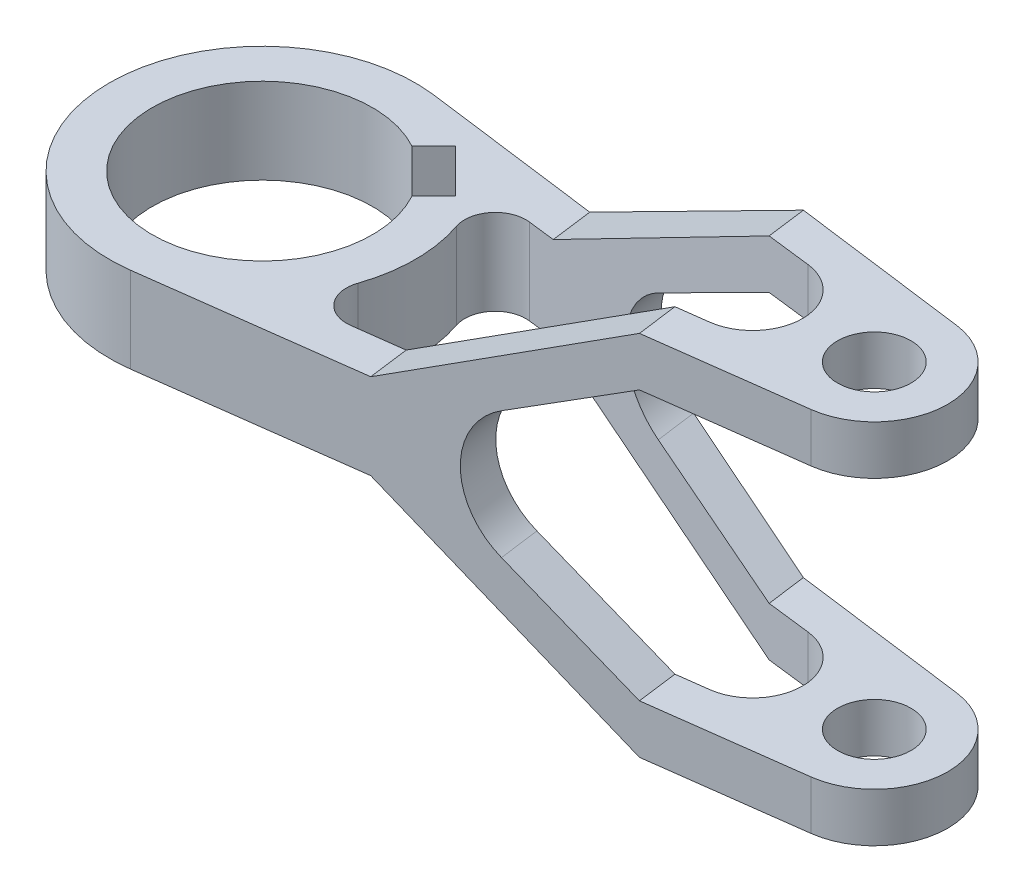
ISO-10303-21;
HEADER;
FILE_DESCRIPTION(('STEP AP214'),'2;1');
FILE_NAME('part.step','',(''),(''),'','','');
FILE_SCHEMA(('AUTOMOTIVE_DESIGN { 1 0 10303 214 1 1 1 1 }'));
ENDSEC;
DATA;
#1=APPLICATION_CONTEXT('core data for automotive mechanical design processes');
#2=APPLICATION_PROTOCOL_DEFINITION('international standard','automotive_design',2000,#1);
#3=PRODUCT_CONTEXT('',#1,'mechanical');
#4=PRODUCT('Part','Part','',(#3));
#5=PRODUCT_RELATED_PRODUCT_CATEGORY('part','',(#4));
#6=PRODUCT_DEFINITION_FORMATION('','',#4);
#7=PRODUCT_DEFINITION_CONTEXT('part definition',#1,'design');
#8=PRODUCT_DEFINITION('design','',#6,#7);
#9=PRODUCT_DEFINITION_SHAPE('','',#8);
#10=(LENGTH_UNIT() NAMED_UNIT(*) SI_UNIT(.MILLI.,.METRE.));
#11=(NAMED_UNIT(*) PLANE_ANGLE_UNIT() SI_UNIT($,.RADIAN.));
#12=(NAMED_UNIT(*) SI_UNIT($,.STERADIAN.) SOLID_ANGLE_UNIT());
#13=UNCERTAINTY_MEASURE_WITH_UNIT(LENGTH_MEASURE(1.E-05),#10,'distance_accuracy_value','');
#14=(GEOMETRIC_REPRESENTATION_CONTEXT(3) GLOBAL_UNCERTAINTY_ASSIGNED_CONTEXT((#13)) GLOBAL_UNIT_ASSIGNED_CONTEXT((#10,
#11,#12)) REPRESENTATION_CONTEXT('',''));
#15=CARTESIAN_POINT('',(0.,0.,0.));
#16=DIRECTION('',(0.,0.,1.));
#17=DIRECTION('',(1.,0.,0.));
#18=AXIS2_PLACEMENT_3D('',#15,#16,#17);
#19=CARTESIAN_POINT('',(100.,-30.,0.));
#20=DIRECTION('',(0.,1.,0.));
#21=DIRECTION('',(0.,0.,1.));
#22=AXIS2_PLACEMENT_3D('',#19,#20,#21);
#23=CYLINDRICAL_SURFACE('',#22,12.);
#24=DIRECTION('',(0.,1.,0.));
#25=VECTOR('',#24,1.);
#26=CARTESIAN_POINT('',(101.56,-30.,11.8981679261977));
#27=LINE('',#26,#25);
#28=CARTESIAN_POINT('',(101.56,22.,11.8981679261977));
#29=VERTEX_POINT('',#28);
#30=CARTESIAN_POINT('',(101.56,30.,11.8981679261977));
#31=VERTEX_POINT('',#30);
#32=EDGE_CURVE('E523',#29,#31,#27,.T.);
#33=ORIENTED_EDGE('',*,*,#32,.F.);
#34=CARTESIAN_POINT('',(100.,22.,0.));
#35=DIRECTION('',(0.,1.,0.));
#36=DIRECTION('',(-1.,0.,0.));
#37=AXIS2_PLACEMENT_3D('',#34,#35,#36);
#38=CIRCLE('',#37,12.);
#39=CARTESIAN_POINT('',(101.56,22.,-11.8981679261977));
#40=VERTEX_POINT('',#39);
#41=EDGE_CURVE('E379',#40,#29,#38,.F.);
#42=ORIENTED_EDGE('',*,*,#41,.F.);
#43=DIRECTION('',(0.,1.,0.));
#44=VECTOR('',#43,1.);
#45=CARTESIAN_POINT('',(101.56,-30.,-11.8981679261977));
#46=LINE('',#45,#44);
#47=CARTESIAN_POINT('',(101.56,30.,-11.8981679261977));
#48=VERTEX_POINT('',#47);
#49=EDGE_CURVE('E520',#40,#48,#46,.T.);
#50=ORIENTED_EDGE('',*,*,#49,.T.);
#51=CARTESIAN_POINT('',(100.,30.,0.));
#52=DIRECTION('',(0.,1.,0.));
#53=DIRECTION('',(0.,0.,1.));
#54=AXIS2_PLACEMENT_3D('',#51,#52,#53);
#55=CIRCLE('',#54,12.);
#56=EDGE_CURVE('E473',#31,#48,#55,.T.);
#57=ORIENTED_EDGE('',*,*,#56,.F.);
#58=EDGE_LOOP('',(#33,#42,#50,#57));
#59=FACE_BOUND('',#58,.T.);
#60=ADVANCED_FACE('F39',(#59),#23,.T.);
#61=CARTESIAN_POINT('',(79.8468488608504,-30.,-0.265397351138166));
#62=DIRECTION('',(0.,1.,0.));
#63=DIRECTION('',(0.,0.,1.));
#64=AXIS2_PLACEMENT_3D('',#61,#62,#63);
#65=CYLINDRICAL_SURFACE('',#64,8.15489857556715);
#66=DIRECTION('',(0.,1.,0.));
#67=VECTOR('',#66,1.);
#68=CARTESIAN_POINT('',(80.8254366899184,-30.,-8.36136774625368));
#69=LINE('',#68,#67);
#70=CARTESIAN_POINT('',(80.8254366899184,22.,-8.36136774625369));
#71=VERTEX_POINT('',#70);
#72=CARTESIAN_POINT('',(80.8254366899184,30.,-8.36136774625368));
#73=VERTEX_POINT('',#72);
#74=EDGE_CURVE('E499',#71,#73,#69,.T.);
#75=ORIENTED_EDGE('',*,*,#74,.F.);
#76=CARTESIAN_POINT('',(79.8468488608504,22.,-0.265397351138166));
#77=DIRECTION('',(0.,1.,0.));
#78=DIRECTION('',(-1.,0.,0.));
#79=AXIS2_PLACEMENT_3D('',#76,#77,#78);
#80=CIRCLE('',#79,8.15489857556715);
#81=CARTESIAN_POINT('',(80.9069856756741,22.,7.82029870496254));
#82=VERTEX_POINT('',#81);
#83=EDGE_CURVE('E310',#71,#82,#80,.F.);
#84=ORIENTED_EDGE('',*,*,#83,.T.);
#85=DIRECTION('',(0.,1.,0.));
#86=VECTOR('',#85,1.);
#87=CARTESIAN_POINT('',(80.9069856756741,-30.,7.82029870496254));
#88=LINE('',#87,#86);
#89=CARTESIAN_POINT('',(80.9069856756741,30.,7.82029870496254));
#90=VERTEX_POINT('',#89);
#91=EDGE_CURVE('E503',#82,#90,#88,.T.);
#92=ORIENTED_EDGE('',*,*,#91,.T.);
#93=CARTESIAN_POINT('',(79.8468488608504,30.,-0.265397351138166));
#94=DIRECTION('',(0.,1.,0.));
#95=DIRECTION('',(0.,0.,1.));
#96=AXIS2_PLACEMENT_3D('',#93,#94,#95);
#97=CIRCLE('',#96,8.15489857556715);
#98=EDGE_CURVE('E464',#90,#73,#97,.T.);
#99=ORIENTED_EDGE('',*,*,#98,.T.);
#100=EDGE_LOOP('',(#75,#84,#92,#99));
#101=FACE_BOUND('',#100,.T.);
#102=ADVANCED_FACE('F558',(#101),#65,.F.);
#103=CARTESIAN_POINT('',(100.,-30.,0.));
#104=DIRECTION('',(0.,1.,0.));
#105=DIRECTION('',(0.,0.,1.));
#106=AXIS2_PLACEMENT_3D('',#103,#104,#105);
#107=CYLINDRICAL_SURFACE('',#106,6.);
#108=CARTESIAN_POINT('',(100.,22.,0.));
#109=DIRECTION('',(0.,1.,0.));
#110=DIRECTION('',(-1.,0.,0.));
#111=AXIS2_PLACEMENT_3D('',#108,#109,#110);
#112=CIRCLE('',#111,6.);
#113=CARTESIAN_POINT('',(94.,22.,0.));
#114=VERTEX_POINT('',#113);
#115=EDGE_CURVE('E307',#114,#114,#112,.F.);
#116=ORIENTED_EDGE('',*,*,#115,.T.);
#117=EDGE_LOOP('',(#116));
#118=FACE_BOUND('',#117,.T.);
#119=CARTESIAN_POINT('',(100.,30.,0.));
#120=DIRECTION('',(0.,1.,0.));
#121=DIRECTION('',(0.,0.,1.));
#122=AXIS2_PLACEMENT_3D('',#119,#120,#121);
#123=CIRCLE('',#122,6.);
#124=CARTESIAN_POINT('',(100.,30.,6.));
#125=VERTEX_POINT('',#124);
#126=EDGE_CURVE('E458',#125,#125,#123,.T.);
#127=ORIENTED_EDGE('',*,*,#126,.T.);
#128=EDGE_LOOP('',(#127));
#129=FACE_BOUND('',#128,.T.);
#130=ADVANCED_FACE('F618',(#118,#129),#107,.F.);
#131=CARTESIAN_POINT('',(0.,-30.,0.));
#132=DIRECTION('',(0.,1.,0.));
#133=DIRECTION('',(0.,0.,1.));
#134=AXIS2_PLACEMENT_3D('',#131,#132,#133);
#135=CYLINDRICAL_SURFACE('',#134,25.);
#136=CARTESIAN_POINT('',(0.,-7.,0.));
#137=DIRECTION('',(0.,-1.,0.));
#138=DIRECTION('',(1.,0.,0.));
#139=AXIS2_PLACEMENT_3D('',#136,#137,#138);
#140=CIRCLE('',#139,25.);
#141=CARTESIAN_POINT('',(3.25000000000001,-7.,-24.7878498462452));
#142=VERTEX_POINT('',#141);
#143=CARTESIAN_POINT('',(3.25,-7.,24.7878498462453));
#144=VERTEX_POINT('',#143);
#145=EDGE_CURVE('E421',#142,#144,#140,.F.);
#146=ORIENTED_EDGE('',*,*,#145,.T.);
#147=DIRECTION('',(0.,1.,0.));
#148=VECTOR('',#147,1.);
#149=CARTESIAN_POINT('',(3.25000000000001,-30.,24.7878498462452));
#150=LINE('',#149,#148);
#151=CARTESIAN_POINT('',(3.25,7.,24.7878498462453));
#152=VERTEX_POINT('',#151);
#153=EDGE_CURVE('E514',#144,#152,#150,.T.);
#154=ORIENTED_EDGE('',*,*,#153,.T.);
#155=CARTESIAN_POINT('',(0.,7.,0.));
#156=DIRECTION('',(0.,-1.,0.));
#157=DIRECTION('',(1.,0.,0.));
#158=AXIS2_PLACEMENT_3D('',#155,#156,#157);
#159=CIRCLE('',#158,25.);
#160=CARTESIAN_POINT('',(3.25000000000001,6.99999999999999,-24.7878498462452));
#161=VERTEX_POINT('',#160);
#162=EDGE_CURVE('E455',#161,#152,#159,.F.);
#163=ORIENTED_EDGE('',*,*,#162,.F.);
#164=DIRECTION('',(0.,1.,0.));
#165=VECTOR('',#164,1.);
#166=CARTESIAN_POINT('',(3.25000000000001,-30.,-24.7878498462452));
#167=LINE('',#166,#165);
#168=EDGE_CURVE('E515',#142,#161,#167,.T.);
#169=ORIENTED_EDGE('',*,*,#168,.F.);
#170=EDGE_LOOP('',(#146,#154,#163,#169));
#171=FACE_BOUND('',#170,.T.);
#172=ADVANCED_FACE('F41',(#171),#135,.T.);
#173=CARTESIAN_POINT('',(3.25000000000001,-30.,-24.7878498462452));
#174=DIRECTION('',(0.13,0.,-0.991513993849809));
#175=DIRECTION('',(-0.99151399384981,0.,-0.13));
#176=AXIS2_PLACEMENT_3D('',#173,#174,#175);
#177=PLANE('',#176);
#178=DIRECTION('',(0.99151399384981,0.,0.13));
#179=VECTOR('',#178,1.);
#180=CARTESIAN_POINT('',(3.25,22.,-24.7878498462452));
#181=LINE('',#180,#179);
#182=CARTESIAN_POINT('',(72.7304389916733,22.,-15.6780872761309));
#183=VERTEX_POINT('',#182);
#184=EDGE_CURVE('E381',#183,#40,#181,.T.);
#185=ORIENTED_EDGE('',*,*,#184,.F.);
#186=DIRECTION('',(0.865899632431298,0.487163916222032,0.113530371648108));
#187=VECTOR('',#186,1.);
#188=CARTESIAN_POINT('',(-2.19572195163312,-20.1542181397328,-25.5018527328445));
#189=LINE('',#188,#187);
#190=CARTESIAN_POINT('',(52.0985764233662,10.3923048454133,-18.3831848849562));
#191=VERTEX_POINT('',#190);
#192=EDGE_CURVE('E386',#191,#183,#189,.T.);
#193=ORIENTED_EDGE('',*,*,#192,.F.);
#194=CARTESIAN_POINT('',(58.2557736528206,0.,-17.5758986088229));
#195=DIRECTION('',(0.13,0.,-0.991513993849809));
#196=DIRECTION('',(0.99151399384981,0.,0.13));
#197=AXIS2_PLACEMENT_3D('',#194,#195,#196);
#198=ELLIPSE('',#197,12.4197888635893,12.);
#199=CARTESIAN_POINT('',(52.0985764233662,-10.3923048454133,-18.3831848849562));
#200=VERTEX_POINT('',#199);
#201=EDGE_CURVE('E391',#200,#191,#198,.T.);
#202=ORIENTED_EDGE('',*,*,#201,.F.);
#203=DIRECTION('',(-0.865899632431298,0.487163916222032,-0.113530371648108));
#204=VECTOR('',#203,1.);
#205=CARTESIAN_POINT('',(23.1143814077938,5.91449726360561,-22.1833787051104));
#206=LINE('',#205,#204);
#207=CARTESIAN_POINT('',(72.7304389916733,-22.,-15.6780872761309));
#208=VERTEX_POINT('',#207);
#209=EDGE_CURVE('E396',#208,#200,#206,.T.);
#210=ORIENTED_EDGE('',*,*,#209,.F.);
#211=DIRECTION('',(-0.99151399384981,0.,-0.13));
#212=VECTOR('',#211,1.);
#213=CARTESIAN_POINT('',(3.25000000000001,-22.,-24.7878498462452));
#214=LINE('',#213,#212);
#215=CARTESIAN_POINT('',(101.56,-22.,-11.8981679261977));
#216=VERTEX_POINT('',#215);
#217=EDGE_CURVE('E311',#216,#208,#214,.T.);
#218=ORIENTED_EDGE('',*,*,#217,.F.);
#219=CARTESIAN_POINT('',(101.56,-30.,-11.8981679261977));
#220=VERTEX_POINT('',#219);
#221=EDGE_CURVE('E517',#220,#216,#46,.T.);
#222=ORIENTED_EDGE('',*,*,#221,.F.);
#223=DIRECTION('',(-0.991513993849809,0.,-0.13));
#224=VECTOR('',#223,1.);
#225=CARTESIAN_POINT('',(3.25000000000001,-30.,-24.7878498462452));
#226=LINE('',#225,#224);
#227=CARTESIAN_POINT('',(72.7304389916733,-30.,-15.6780872761309));
#228=VERTEX_POINT('',#227);
#229=EDGE_CURVE('E511',#220,#228,#226,.T.);
#230=ORIENTED_EDGE('',*,*,#229,.T.);
#231=DIRECTION('',(-0.862291237243005,0.493631316767308,-0.113057265491879));
#232=VECTOR('',#231,1.);
#233=CARTESIAN_POINT('',(20.1804289764802,0.0830270789643206,-22.568056902732));
#234=LINE('',#233,#232);
#235=CARTESIAN_POINT('',(32.553291021262,-7.,-20.9458185119491));
#236=VERTEX_POINT('',#235);
#237=EDGE_CURVE('E425',#228,#236,#234,.T.);
#238=ORIENTED_EDGE('',*,*,#237,.T.);
#239=DIRECTION('',(-0.991513993849809,0.,-0.13));
#240=VECTOR('',#239,1.);
#241=CARTESIAN_POINT('',(3.25000000000001,-7.,-24.7878498462452));
#242=LINE('',#241,#240);
#243=EDGE_CURVE('E418',#236,#142,#242,.T.);
#244=ORIENTED_EDGE('',*,*,#243,.T.);
#245=ORIENTED_EDGE('',*,*,#168,.T.);
#246=DIRECTION('',(-0.991513993849809,0.,-0.13));
#247=VECTOR('',#246,1.);
#248=CARTESIAN_POINT('',(3.25000000000001,6.99999999999999,-24.7878498462452));
#249=LINE('',#248,#247);
#250=CARTESIAN_POINT('',(32.553291021262,7.,-20.9458185119491));
#251=VERTEX_POINT('',#250);
#252=EDGE_CURVE('E452',#251,#161,#249,.T.);
#253=ORIENTED_EDGE('',*,*,#252,.F.);
#254=DIRECTION('',(-0.862291237243005,-0.493631316767308,-0.113057265491879));
#255=VECTOR('',#254,1.);
#256=CARTESIAN_POINT('',(-5.35880855615031,-14.7033396925699,-25.916573312824));
#257=LINE('',#256,#255);
#258=CARTESIAN_POINT('',(72.7304389916733,30.,-15.6780872761309));
#259=VERTEX_POINT('',#258);
#260=EDGE_CURVE('E283',#259,#251,#257,.T.);
#261=ORIENTED_EDGE('',*,*,#260,.F.);
#262=DIRECTION('',(-0.991513993849809,0.,-0.13));
#263=VECTOR('',#262,1.);
#264=CARTESIAN_POINT('',(3.25000000000001,30.,-24.7878498462452));
#265=LINE('',#264,#263);
#266=EDGE_CURVE('E476',#48,#259,#265,.T.);
#267=ORIENTED_EDGE('',*,*,#266,.F.);
#268=ORIENTED_EDGE('',*,*,#49,.F.);
#269=EDGE_LOOP('',(#185,#193,#202,#210,#218,#222,#230,#238,#244,#245,#253,#261,#267,#268));
#270=FACE_BOUND('',#269,.T.);
#271=ADVANCED_FACE('F546',(#270),#177,.T.);
#272=CARTESIAN_POINT('',(3.25000000000001,-30.,24.7878498462452));
#273=DIRECTION('',(0.13,0.,0.991513993849809));
#274=DIRECTION('',(0.99151399384981,0.,-0.13));
#275=AXIS2_PLACEMENT_3D('',#272,#273,#274);
#276=PLANE('',#275);
#277=DIRECTION('',(-0.99151399384981,0.,0.13));
#278=VECTOR('',#277,1.);
#279=CARTESIAN_POINT('',(113.458167926198,22.,10.3381679261977));
#280=LINE('',#279,#278);
#281=CARTESIAN_POINT('',(76.7721501537547,22.,15.1481679261977));
#282=VERTEX_POINT('',#281);
#283=EDGE_CURVE('E331',#29,#282,#280,.T.);
#284=ORIENTED_EDGE('',*,*,#283,.F.);
#285=ORIENTED_EDGE('',*,*,#32,.T.);
#286=DIRECTION('',(0.991513993849809,0.,-0.13));
#287=VECTOR('',#286,1.);
#288=CARTESIAN_POINT('',(3.25000000000001,30.,24.7878498462452));
#289=LINE('',#288,#287);
#290=CARTESIAN_POINT('',(76.7721501537547,30.,15.1481679261977));
#291=VERTEX_POINT('',#290);
#292=EDGE_CURVE('E470',#291,#31,#289,.T.);
#293=ORIENTED_EDGE('',*,*,#292,.F.);
#294=DIRECTION('',(0.854908218410472,0.506525355946065,-0.112089258530623));
#295=VECTOR('',#294,1.);
#296=CARTESIAN_POINT('',(37.9529897847433,7.,20.2378498462452));
#297=LINE('',#296,#295);
#298=CARTESIAN_POINT('',(37.9529897847433,7.,20.2378498462452));
#299=VERTEX_POINT('',#298);
#300=EDGE_CURVE('E431',#299,#291,#297,.T.);
#301=ORIENTED_EDGE('',*,*,#300,.F.);
#302=DIRECTION('',(0.991513993849809,0.,-0.13));
#303=VECTOR('',#302,1.);
#304=CARTESIAN_POINT('',(-21.5378498462452,7.,28.0378498462453));
#305=LINE('',#304,#303);
#306=EDGE_CURVE('E428',#152,#299,#305,.T.);
#307=ORIENTED_EDGE('',*,*,#306,.F.);
#308=ORIENTED_EDGE('',*,*,#153,.F.);
#309=DIRECTION('',(0.991513993849809,0.,-0.13));
#310=VECTOR('',#309,1.);
#311=CARTESIAN_POINT('',(-21.5378498462452,-7.,28.0378498462453));
#312=LINE('',#311,#310);
#313=CARTESIAN_POINT('',(37.9529897847433,-7.,20.2378498462452));
#314=VERTEX_POINT('',#313);
#315=EDGE_CURVE('E401',#144,#314,#312,.T.);
#316=ORIENTED_EDGE('',*,*,#315,.T.);
#317=DIRECTION('',(0.854908218410472,-0.506525355946065,-0.112089258530623));
#318=VECTOR('',#317,1.);
#319=CARTESIAN_POINT('',(37.9529897847433,-7.,20.2378498462452));
#320=LINE('',#319,#318);
#321=CARTESIAN_POINT('',(76.7721501537547,-30.,15.1481679261977));
#322=VERTEX_POINT('',#321);
#323=EDGE_CURVE('E398',#314,#322,#320,.T.);
#324=ORIENTED_EDGE('',*,*,#323,.T.);
#325=DIRECTION('',(0.991513993849809,0.,-0.13));
#326=VECTOR('',#325,1.);
#327=CARTESIAN_POINT('',(3.25000000000001,-30.,24.7878498462452));
#328=LINE('',#327,#326);
#329=CARTESIAN_POINT('',(101.56,-30.,11.8981679261977));
#330=VERTEX_POINT('',#329);
#331=EDGE_CURVE('E493',#322,#330,#328,.T.);
#332=ORIENTED_EDGE('',*,*,#331,.T.);
#333=CARTESIAN_POINT('',(101.56,-22.,11.8981679261977));
#334=VERTEX_POINT('',#333);
#335=EDGE_CURVE('E521',#330,#334,#27,.T.);
#336=ORIENTED_EDGE('',*,*,#335,.T.);
#337=DIRECTION('',(0.99151399384981,0.,-0.13));
#338=VECTOR('',#337,1.);
#339=CARTESIAN_POINT('',(76.7721501537547,-22.,15.1481679261977));
#340=LINE('',#339,#338);
#341=CARTESIAN_POINT('',(76.7721501537547,-22.,15.1481679261977));
#342=VERTEX_POINT('',#341);
#343=EDGE_CURVE('E349',#342,#334,#340,.T.);
#344=ORIENTED_EDGE('',*,*,#343,.F.);
#345=DIRECTION('',(0.858676306881702,-0.500000000000001,-0.112583302491977));
#346=VECTOR('',#345,1.);
#347=CARTESIAN_POINT('',(56.8376445402564,-10.3923048454133,17.7618332358447));
#348=LINE('',#347,#346);
#349=CARTESIAN_POINT('',(56.8376445402564,-10.3923048454133,17.7618332358447));
#350=VERTEX_POINT('',#349);
#351=EDGE_CURVE('E346',#350,#342,#348,.T.);
#352=ORIENTED_EDGE('',*,*,#351,.F.);
#353=CARTESIAN_POINT('',(62.7867285033553,0.,16.9818332358447));
#354=DIRECTION('',(0.13,0.,0.99151399384981));
#355=DIRECTION('',(0.99151399384981,0.,-0.13));
#356=AXIS2_PLACEMENT_3D('',#353,#354,#355);
#357=CIRCLE('',#356,12.);
#358=CARTESIAN_POINT('',(56.8376445402564,10.3923048454133,17.7618332358447));
#359=VERTEX_POINT('',#358);
#360=EDGE_CURVE('E343',#359,#350,#357,.T.);
#361=ORIENTED_EDGE('',*,*,#360,.F.);
#362=DIRECTION('',(-0.858676306881702,-0.500000000000001,0.112583302491977));
#363=VECTOR('',#362,1.);
#364=CARTESIAN_POINT('',(56.8376445402564,10.3923048454133,17.7618332358447));
#365=LINE('',#364,#363);
#366=EDGE_CURVE('E334',#282,#359,#365,.T.);
#367=ORIENTED_EDGE('',*,*,#366,.F.);
#368=EDGE_LOOP('',(#284,#285,#293,#301,#307,#308,#316,#324,#332,#336,#344,#352,#361,#367));
#369=FACE_BOUND('',#368,.T.);
#370=ADVANCED_FACE('F531',(#369),#276,.T.);
#371=CARTESIAN_POINT('',(0.,-30.,0.));
#372=DIRECTION('',(0.,1.,0.));
#373=DIRECTION('',(0.,0.,1.));
#374=AXIS2_PLACEMENT_3D('',#371,#372,#373);
#375=PLANE('',#374);
#376=CARTESIAN_POINT('',(100.,-30.,0.));
#377=DIRECTION('',(0.,1.,0.));
#378=DIRECTION('',(0.,0.,1.));
#379=AXIS2_PLACEMENT_3D('',#376,#377,#378);
#380=CIRCLE('',#379,6.);
#381=CARTESIAN_POINT('',(100.,-30.,6.));
#382=VERTEX_POINT('',#381);
#383=EDGE_CURVE('E479',#382,#382,#380,.T.);
#384=ORIENTED_EDGE('',*,*,#383,.T.);
#385=EDGE_LOOP('',(#384));
#386=FACE_BOUND('',#385,.T.);
#387=DIRECTION('',(0.13,0.,0.991513993849809));
#388=VECTOR('',#387,1.);
#389=CARTESIAN_POINT('',(69.8772296737428,-30.,-37.4396024000594));
#390=LINE('',#389,#388);
#391=CARTESIAN_POINT('',(73.5748456620722,-30.,-9.23777165920292));
#392=VERTEX_POINT('',#391);
#393=EDGE_CURVE('E407',#228,#392,#390,.T.);
#394=ORIENTED_EDGE('',*,*,#393,.F.);
#395=ORIENTED_EDGE('',*,*,#229,.F.);
#396=CARTESIAN_POINT('',(100.,-30.,0.));
#397=DIRECTION('',(0.,1.,0.));
#398=DIRECTION('',(0.,0.,1.));
#399=AXIS2_PLACEMENT_3D('',#396,#397,#398);
#400=CIRCLE('',#399,12.);
#401=EDGE_CURVE('E508',#330,#220,#400,.T.);
#402=ORIENTED_EDGE('',*,*,#401,.F.);
#403=ORIENTED_EDGE('',*,*,#331,.F.);
#404=CARTESIAN_POINT('',(75.8974898399409,-30.,8.47710684149396));
#405=VERTEX_POINT('',#404);
#406=EDGE_CURVE('E404',#405,#322,#390,.T.);
#407=ORIENTED_EDGE('',*,*,#406,.F.);
#408=DIRECTION('',(0.991513993849809,0.,-0.13));
#409=VECTOR('',#408,1.);
#410=CARTESIAN_POINT('',(29.0516392942011,-30.,14.6191891607765));
#411=LINE('',#410,#409);
#412=CARTESIAN_POINT('',(80.9069856756741,-30.,7.82029870496254));
#413=VERTEX_POINT('',#412);
#414=EDGE_CURVE('E482',#405,#413,#411,.T.);
#415=ORIENTED_EDGE('',*,*,#414,.T.);
#416=CARTESIAN_POINT('',(79.8468488608504,-30.,-0.265397351138166));
#417=DIRECTION('',(0.,1.,0.));
#418=DIRECTION('',(0.,0.,1.));
#419=AXIS2_PLACEMENT_3D('',#416,#417,#418);
#420=CIRCLE('',#419,8.15489857556715);
#421=CARTESIAN_POINT('',(80.8254366899184,-30.,-8.36136774625368));
#422=VERTEX_POINT('',#421);
#423=EDGE_CURVE('E484',#413,#422,#420,.T.);
#424=ORIENTED_EDGE('',*,*,#423,.T.);
#425=DIRECTION('',(-0.992773891679269,0.,-0.12));
#426=VECTOR('',#425,1.);
#427=CARTESIAN_POINT('',(29.0016392942011,-30.,-14.6254886499238));
#428=LINE('',#427,#426);
#429=EDGE_CURVE('E487',#422,#392,#428,.T.);
#430=ORIENTED_EDGE('',*,*,#429,.T.);
#431=EDGE_LOOP('',(#394,#395,#402,#403,#407,#415,#424,#430));
#432=FACE_BOUND('',#431,.T.);
#433=ADVANCED_FACE('F581',(#386,#432),#375,.F.);
#434=CARTESIAN_POINT('',(0.,-30.,0.));
#435=DIRECTION('',(0.,1.,0.));
#436=DIRECTION('',(0.,0.,1.));
#437=AXIS2_PLACEMENT_3D('',#434,#435,#436);
#438=CYLINDRICAL_SURFACE('',#437,25.);
#439=CARTESIAN_POINT('',(0.,-7.,0.));
#440=DIRECTION('',(0.,-1.,0.));
#441=DIRECTION('',(1.,0.,0.));
#442=AXIS2_PLACEMENT_3D('',#439,#440,#441);
#443=CIRCLE('',#442,25.);
#444=CARTESIAN_POINT('',(23.6680327451676,-7.,-8.05134932627292));
#445=VERTEX_POINT('',#444);
#446=CARTESIAN_POINT('',(23.6680327451676,-7.,8.05134932627293));
#447=VERTEX_POINT('',#446);
#448=EDGE_CURVE('E412',#445,#447,#443,.T.);
#449=ORIENTED_EDGE('',*,*,#448,.F.);
#450=DIRECTION('',(0.,1.,0.));
#451=VECTOR('',#450,1.);
#452=CARTESIAN_POINT('',(23.6680327451676,-30.,-8.05134932627292));
#453=LINE('',#452,#451);
#454=CARTESIAN_POINT('',(23.6680327451676,7.,-8.05134932627292));
#455=VERTEX_POINT('',#454);
#456=EDGE_CURVE('E491',#445,#455,#453,.T.);
#457=ORIENTED_EDGE('',*,*,#456,.T.);
#458=CARTESIAN_POINT('',(0.,7.,0.));
#459=DIRECTION('',(0.,-1.,0.));
#460=DIRECTION('',(1.,0.,0.));
#461=AXIS2_PLACEMENT_3D('',#458,#459,#460);
#462=CIRCLE('',#461,25.);
#463=CARTESIAN_POINT('',(23.6680327451676,7.,8.05134932627293));
#464=VERTEX_POINT('',#463);
#465=EDGE_CURVE('E443',#455,#464,#462,.T.);
#466=ORIENTED_EDGE('',*,*,#465,.T.);
#467=DIRECTION('',(0.,1.,0.));
#468=VECTOR('',#467,1.);
#469=CARTESIAN_POINT('',(23.6680327451676,-30.,8.05134932627293));
#470=LINE('',#469,#468);
#471=EDGE_CURVE('E490',#447,#464,#470,.T.);
#472=ORIENTED_EDGE('',*,*,#471,.F.);
#473=EDGE_LOOP('',(#449,#457,#466,#472));
#474=FACE_BOUND('',#473,.T.);
#475=ADVANCED_FACE('F846',(#474),#438,.T.);
#476=CARTESIAN_POINT('',(28.4016392942011,-30.,-9.6616191915275));
#477=DIRECTION('',(0.,1.,0.));
#478=DIRECTION('',(0.,0.,1.));
#479=AXIS2_PLACEMENT_3D('',#476,#477,#478);
#480=CYLINDRICAL_SURFACE('',#479,5.);
#481=CARTESIAN_POINT('',(28.4016392942011,-7.,-9.6616191915275));
#482=DIRECTION('',(0.,-1.,0.));
#483=DIRECTION('',(1.,0.,0.));
#484=AXIS2_PLACEMENT_3D('',#481,#482,#483);
#485=CIRCLE('',#484,5.);
#486=CARTESIAN_POINT('',(29.0016392942011,-7.,-14.6254886499238));
#487=VERTEX_POINT('',#486);
#488=EDGE_CURVE('E414',#487,#445,#485,.F.);
#489=ORIENTED_EDGE('',*,*,#488,.F.);
#490=DIRECTION('',(0.,1.,0.));
#491=VECTOR('',#490,1.);
#492=CARTESIAN_POINT('',(29.0016392942011,-30.,-14.6254886499238));
#493=LINE('',#492,#491);
#494=CARTESIAN_POINT('',(29.0016392942011,7.,-14.6254886499238));
#495=VERTEX_POINT('',#494);
#496=EDGE_CURVE('E494',#487,#495,#493,.T.);
#497=ORIENTED_EDGE('',*,*,#496,.T.);
#498=CARTESIAN_POINT('',(28.4016392942011,7.,-9.6616191915275));
#499=DIRECTION('',(0.,-1.,0.));
#500=DIRECTION('',(1.,0.,0.));
#501=AXIS2_PLACEMENT_3D('',#498,#499,#500);
#502=CIRCLE('',#501,5.);
#503=EDGE_CURVE('E446',#495,#455,#502,.F.);
#504=ORIENTED_EDGE('',*,*,#503,.T.);
#505=ORIENTED_EDGE('',*,*,#456,.F.);
#506=EDGE_LOOP('',(#489,#497,#504,#505));
#507=FACE_BOUND('',#506,.T.);
#508=ADVANCED_FACE('F838',(#507),#480,.F.);
#509=CARTESIAN_POINT('',(29.0016392942011,-30.,-14.6254886499238));
#510=DIRECTION('',(0.12,0.,-0.992773891679269));
#511=DIRECTION('',(-0.992773891679269,0.,-0.12));
#512=AXIS2_PLACEMENT_3D('',#509,#510,#511);
#513=PLANE('',#512);
#514=DIRECTION('',(0.866456824803477,0.488143276417034,0.104731621014474));
#515=VECTOR('',#514,1.);
#516=CARTESIAN_POINT('',(17.6290510714964,-9.51866624097763,-16.0001325624628));
#517=LINE('',#516,#515);
#518=CARTESIAN_POINT('',(52.971127096588,10.3923048454133,-11.7282140938604));
#519=VERTEX_POINT('',#518);
#520=CARTESIAN_POINT('',(73.5748456620722,22.,-9.23777165920292));
#521=VERTEX_POINT('',#520);
#522=EDGE_CURVE('E383',#519,#521,#517,.T.);
#523=ORIENTED_EDGE('',*,*,#522,.T.);
#524=DIRECTION('',(0.992773891679269,0.,0.12));
#525=VECTOR('',#524,1.);
#526=CARTESIAN_POINT('',(29.0016392942011,22.,-14.6254886499239));
#527=LINE('',#526,#525);
#528=EDGE_CURVE('E376',#521,#71,#527,.T.);
#529=ORIENTED_EDGE('',*,*,#528,.T.);
#530=ORIENTED_EDGE('',*,*,#74,.T.);
#531=DIRECTION('',(-0.992773891679269,0.,-0.12));
#532=VECTOR('',#531,1.);
#533=CARTESIAN_POINT('',(29.0016392942011,30.,-14.6254886499238));
#534=LINE('',#533,#532);
#535=CARTESIAN_POINT('',(73.5748456620722,30.,-9.23777165920292));
#536=VERTEX_POINT('',#535);
#537=EDGE_CURVE('E467',#73,#536,#534,.T.);
#538=ORIENTED_EDGE('',*,*,#537,.T.);
#539=DIRECTION('',(-0.862831666687416,-0.494615400324786,-0.104293435665752));
#540=VECTOR('',#539,1.);
#541=CARTESIAN_POINT('',(14.3000345514443,-3.97908950098908,-16.4025222563845));
#542=LINE('',#541,#540);
#543=CARTESIAN_POINT('',(33.4525034932287,7.,-14.0874973627236));
#544=VERTEX_POINT('',#543);
#545=EDGE_CURVE('E288',#536,#544,#542,.T.);
#546=ORIENTED_EDGE('',*,*,#545,.T.);
#547=DIRECTION('',(-0.992773891679269,0.,-0.12));
#548=VECTOR('',#547,1.);
#549=CARTESIAN_POINT('',(29.0016392942011,7.,-14.6254886499238));
#550=LINE('',#549,#548);
#551=EDGE_CURVE('E449',#544,#495,#550,.T.);
#552=ORIENTED_EDGE('',*,*,#551,.T.);
#553=ORIENTED_EDGE('',*,*,#496,.F.);
#554=DIRECTION('',(-0.992773891679269,0.,-0.12));
#555=VECTOR('',#554,1.);
#556=CARTESIAN_POINT('',(29.0016392942011,-7.,-14.6254886499238));
#557=LINE('',#556,#555);
#558=CARTESIAN_POINT('',(33.4525034932287,-7.,-14.0874973627236));
#559=VERTEX_POINT('',#558);
#560=EDGE_CURVE('E416',#559,#487,#557,.T.);
#561=ORIENTED_EDGE('',*,*,#560,.F.);
#562=DIRECTION('',(-0.862831666687416,0.494615400324786,-0.104293435665752));
#563=VECTOR('',#562,1.);
#564=CARTESIAN_POINT('',(39.9062243653343,-10.6995741533178,-13.3074138904007));
#565=LINE('',#564,#563);
#566=EDGE_CURVE('E423',#392,#559,#565,.T.);
#567=ORIENTED_EDGE('',*,*,#566,.F.);
#568=ORIENTED_EDGE('',*,*,#429,.F.);
#569=CARTESIAN_POINT('',(80.8254366899184,-22.,-8.36136774625368));
#570=VERTEX_POINT('',#569);
#571=EDGE_CURVE('E496',#422,#570,#69,.T.);
#572=ORIENTED_EDGE('',*,*,#571,.T.);
#573=DIRECTION('',(-0.992773891679269,0.,-0.12));
#574=VECTOR('',#573,1.);
#575=CARTESIAN_POINT('',(29.0016392942011,-22.,-14.6254886499238));
#576=LINE('',#575,#574);
#577=CARTESIAN_POINT('',(73.5748456620722,-22.,-9.23777165920292));
#578=VERTEX_POINT('',#577);
#579=EDGE_CURVE('E62',#570,#578,#576,.T.);
#580=ORIENTED_EDGE('',*,*,#579,.T.);
#581=DIRECTION('',(-0.866456824803477,0.488143276417034,-0.104731621014474));
#582=VECTOR('',#581,1.);
#583=CARTESIAN_POINT('',(43.0063554715046,-4.77836525769178,-12.9326903648745));
#584=LINE('',#583,#582);
#585=CARTESIAN_POINT('',(52.971127096588,-10.3923048454133,-11.7282140938604));
#586=VERTEX_POINT('',#585);
#587=EDGE_CURVE('E393',#578,#586,#584,.T.);
#588=ORIENTED_EDGE('',*,*,#587,.T.);
#589=CARTESIAN_POINT('',(59.1199252696977,0.,-10.984987678503));
#590=DIRECTION('',(0.12,0.,-0.992773891679269));
#591=DIRECTION('',(0.992773891679269,0.,0.12));
#592=AXIS2_PLACEMENT_3D('',#589,#590,#591);
#593=ELLIPSE('',#592,12.3871069226228,12.);
#594=EDGE_CURVE('E388',#586,#519,#593,.T.);
#595=ORIENTED_EDGE('',*,*,#594,.T.);
#596=EDGE_LOOP('',(#523,#529,#530,#538,#546,#552,#553,#561,#567,#568,#572,#580,#588,#595));
#597=FACE_BOUND('',#596,.T.);
#598=ADVANCED_FACE('F555',(#597),#513,.F.);
#599=CARTESIAN_POINT('',(29.0516392942011,-30.,14.6191891607765));
#600=DIRECTION('',(0.13,0.,0.991513993849809));
#601=DIRECTION('',(0.991513993849809,0.,-0.13));
#602=AXIS2_PLACEMENT_3D('',#599,#600,#601);
#603=PLANE('',#602);
#604=ORIENTED_EDGE('',*,*,#91,.F.);
#605=DIRECTION('',(-0.991513993849809,0.,0.13));
#606=VECTOR('',#605,1.);
#607=CARTESIAN_POINT('',(29.0516392942011,22.,14.6191891607766));
#608=LINE('',#607,#606);
#609=CARTESIAN_POINT('',(75.8974898399409,22.,8.47710684149396));
#610=VERTEX_POINT('',#609);
#611=EDGE_CURVE('E373',#82,#610,#608,.T.);
#612=ORIENTED_EDGE('',*,*,#611,.T.);
#613=DIRECTION('',(-0.858676306881702,-0.500000000000001,0.112583302491977));
#614=VECTOR('',#613,1.);
#615=CARTESIAN_POINT('',(18.4375179517118,-11.4584589255153,16.0108344457473));
#616=LINE('',#615,#614);
#617=CARTESIAN_POINT('',(55.9629842264426,10.3923048454133,11.0907721511409));
#618=VERTEX_POINT('',#617);
#619=EDGE_CURVE('E300',#610,#618,#616,.T.);
#620=ORIENTED_EDGE('',*,*,#619,.T.);
#621=CARTESIAN_POINT('',(61.9120681895415,0.,10.3107721511409));
#622=DIRECTION('',(0.13,0.,0.991513993849809));
#623=DIRECTION('',(0.991513993849809,0.,-0.13));
#624=AXIS2_PLACEMENT_3D('',#621,#622,#623);
#625=CIRCLE('',#624,12.);
#626=CARTESIAN_POINT('',(55.9629842264426,-10.3923048454133,11.0907721511409));
#627=VERTEX_POINT('',#626);
#628=EDGE_CURVE('E314',#618,#627,#625,.T.);
#629=ORIENTED_EDGE('',*,*,#628,.T.);
#630=DIRECTION('',(0.858676306881702,-0.500000000000001,-0.112583302491977));
#631=VECTOR('',#630,1.);
#632=CARTESIAN_POINT('',(44.1978071581629,-3.54154107448474,12.633335370988));
#633=LINE('',#632,#631);
#634=CARTESIAN_POINT('',(75.8974898399409,-22.,8.47710684149395));
#635=VERTEX_POINT('',#634);
#636=EDGE_CURVE('E317',#627,#635,#633,.T.);
#637=ORIENTED_EDGE('',*,*,#636,.T.);
#638=DIRECTION('',(0.991513993849809,0.,-0.13));
#639=VECTOR('',#638,1.);
#640=CARTESIAN_POINT('',(29.0516392942011,-22.,14.6191891607765));
#641=LINE('',#640,#639);
#642=CARTESIAN_POINT('',(80.9069856756741,-22.,7.82029870496254));
#643=VERTEX_POINT('',#642);
#644=EDGE_CURVE('E364',#635,#643,#641,.T.);
#645=ORIENTED_EDGE('',*,*,#644,.T.);
#646=EDGE_CURVE('E500',#413,#643,#88,.T.);
#647=ORIENTED_EDGE('',*,*,#646,.F.);
#648=ORIENTED_EDGE('',*,*,#414,.F.);
#649=DIRECTION('',(0.854908218410472,-0.506525355946065,-0.112089258530623));
#650=VECTOR('',#649,1.);
#651=CARTESIAN_POINT('',(41.0707824890182,-9.36549215756206,13.0433277760477));
#652=LINE('',#651,#650);
#653=CARTESIAN_POINT('',(37.0783294709295,-7.,13.5667887615415));
#654=VERTEX_POINT('',#653);
#655=EDGE_CURVE('E298',#654,#405,#652,.T.);
#656=ORIENTED_EDGE('',*,*,#655,.F.);
#657=DIRECTION('',(0.99151399384981,0.,-0.13));
#658=VECTOR('',#657,1.);
#659=CARTESIAN_POINT('',(29.0516392942011,-7.,14.6191891607765));
#660=LINE('',#659,#658);
#661=CARTESIAN_POINT('',(29.0516392942011,-7.,14.6191891607765));
#662=VERTEX_POINT('',#661);
#663=EDGE_CURVE('E410',#662,#654,#660,.T.);
#664=ORIENTED_EDGE('',*,*,#663,.F.);
#665=DIRECTION('',(0.,1.,0.));
#666=VECTOR('',#665,1.);
#667=CARTESIAN_POINT('',(29.0516392942011,-30.,14.6191891607765));
#668=LINE('',#667,#666);
#669=CARTESIAN_POINT('',(29.0516392942011,7.,14.6191891607765));
#670=VERTEX_POINT('',#669);
#671=EDGE_CURVE('E504',#662,#670,#668,.T.);
#672=ORIENTED_EDGE('',*,*,#671,.T.);
#673=DIRECTION('',(0.99151399384981,0.,-0.13));
#674=VECTOR('',#673,1.);
#675=CARTESIAN_POINT('',(29.0516392942011,7.,14.6191891607765));
#676=LINE('',#675,#674);
#677=CARTESIAN_POINT('',(37.0783294709295,7.,13.5667887615415));
#678=VERTEX_POINT('',#677);
#679=EDGE_CURVE('E286',#670,#678,#676,.T.);
#680=ORIENTED_EDGE('',*,*,#679,.T.);
#681=DIRECTION('',(0.854908218410472,0.506525355946065,-0.112089258530623));
#682=VECTOR('',#681,1.);
#683=CARTESIAN_POINT('',(15.0888211111234,-6.02858401541518,16.4498908705449));
#684=LINE('',#683,#682);
#685=CARTESIAN_POINT('',(75.8974898399409,30.,8.47710684149397));
#686=VERTEX_POINT('',#685);
#687=EDGE_CURVE('E436',#678,#686,#684,.T.);
#688=ORIENTED_EDGE('',*,*,#687,.T.);
#689=DIRECTION('',(0.991513993849809,0.,-0.13));
#690=VECTOR('',#689,1.);
#691=CARTESIAN_POINT('',(29.0516392942011,30.,14.6191891607765));
#692=LINE('',#691,#690);
#693=EDGE_CURVE('E461',#686,#90,#692,.T.);
#694=ORIENTED_EDGE('',*,*,#693,.T.);
#695=EDGE_LOOP('',(#604,#612,#620,#629,#637,#645,#647,#648,#656,#664,#672,#680,#688,#694));
#696=FACE_BOUND('',#695,.T.);
#697=ADVANCED_FACE('F561',(#696),#603,.F.);
#698=CARTESIAN_POINT('',(28.4016392942011,-30.,9.6616191915275));
#699=DIRECTION('',(0.,1.,0.));
#700=DIRECTION('',(0.,0.,1.));
#701=AXIS2_PLACEMENT_3D('',#698,#699,#700);
#702=CYLINDRICAL_SURFACE('',#701,5.);
#703=CARTESIAN_POINT('',(28.4016392942011,-7.,9.6616191915275));
#704=DIRECTION('',(0.,-1.,0.));
#705=DIRECTION('',(1.,0.,0.));
#706=AXIS2_PLACEMENT_3D('',#703,#704,#705);
#707=CIRCLE('',#706,5.);
#708=EDGE_CURVE('E296',#447,#662,#707,.F.);
#709=ORIENTED_EDGE('',*,*,#708,.F.);
#710=ORIENTED_EDGE('',*,*,#471,.T.);
#711=CARTESIAN_POINT('',(28.4016392942011,7.,9.6616191915275));
#712=DIRECTION('',(0.,-1.,0.));
#713=DIRECTION('',(1.,0.,0.));
#714=AXIS2_PLACEMENT_3D('',#711,#712,#713);
#715=CIRCLE('',#714,5.);
#716=EDGE_CURVE('E282',#464,#670,#715,.F.);
#717=ORIENTED_EDGE('',*,*,#716,.T.);
#718=ORIENTED_EDGE('',*,*,#671,.F.);
#719=EDGE_LOOP('',(#709,#710,#717,#718));
#720=FACE_BOUND('',#719,.T.);
#721=ADVANCED_FACE('F629',(#720),#702,.F.);
#722=CARTESIAN_POINT('',(0.,-30.,0.));
#723=DIRECTION('',(0.,1.,0.));
#724=DIRECTION('',(0.,0.,1.));
#725=AXIS2_PLACEMENT_3D('',#722,#723,#724);
#726=CYLINDRICAL_SURFACE('',#725,18.);
#727=CARTESIAN_POINT('',(0.,-7.,0.));
#728=DIRECTION('',(0.,-1.,0.));
#729=DIRECTION('',(1.,0.,0.));
#730=AXIS2_PLACEMENT_3D('',#727,#728,#729);
#731=CIRCLE('',#730,18.);
#732=CARTESIAN_POINT('',(8.69148535470471,-7.,-15.7625531665702));
#733=VERTEX_POINT('',#732);
#734=CARTESIAN_POINT('',(15.7625531665702,-7.,-8.69148535470477));
#735=VERTEX_POINT('',#734);
#736=EDGE_CURVE('E294',#733,#735,#731,.F.);
#737=ORIENTED_EDGE('',*,*,#736,.F.);
#738=DIRECTION('',(0.,1.,0.));
#739=VECTOR('',#738,1.);
#740=CARTESIAN_POINT('',(8.69148535470471,-30.,-15.7625531665702));
#741=LINE('',#740,#739);
#742=CARTESIAN_POINT('',(8.69148535470471,7.,-15.7625531665702));
#743=VERTEX_POINT('',#742);
#744=EDGE_CURVE('E281',#733,#743,#741,.T.);
#745=ORIENTED_EDGE('',*,*,#744,.T.);
#746=CARTESIAN_POINT('',(0.,7.,0.));
#747=DIRECTION('',(0.,-1.,0.));
#748=DIRECTION('',(1.,0.,0.));
#749=AXIS2_PLACEMENT_3D('',#746,#747,#748);
#750=CIRCLE('',#749,18.);
#751=CARTESIAN_POINT('',(15.7625531665702,7.,-8.69148535470477));
#752=VERTEX_POINT('',#751);
#753=EDGE_CURVE('E275',#743,#752,#750,.F.);
#754=ORIENTED_EDGE('',*,*,#753,.T.);
#755=DIRECTION('',(0.,1.,0.));
#756=VECTOR('',#755,1.);
#757=CARTESIAN_POINT('',(15.7625531665702,-30.,-8.69148535470477));
#758=LINE('',#757,#756);
#759=EDGE_CURVE('E258',#735,#752,#758,.T.);
#760=ORIENTED_EDGE('',*,*,#759,.F.);
#761=EDGE_LOOP('',(#737,#745,#754,#760));
#762=FACE_BOUND('',#761,.T.);
#763=ADVANCED_FACE('F280',(#762),#726,.F.);
#764=CARTESIAN_POINT('',(100.,-22.,0.));
#765=DIRECTION('',(0.,-1.,0.));
#766=DIRECTION('',(0.,0.,-1.));
#767=AXIS2_PLACEMENT_3D('',#764,#765,#766);
#768=CIRCLE('',#767,12.);
#769=EDGE_CURVE('E368',#334,#216,#768,.F.);
#770=ORIENTED_EDGE('',*,*,#769,.F.);
#771=ORIENTED_EDGE('',*,*,#335,.F.);
#772=ORIENTED_EDGE('',*,*,#401,.T.);
#773=ORIENTED_EDGE('',*,*,#221,.T.);
#774=EDGE_LOOP('',(#770,#771,#772,#773));
#775=FACE_BOUND('',#774,.T.);
#776=ADVANCED_FACE('F613',(#775),#23,.T.);
#777=ORIENTED_EDGE('',*,*,#646,.T.);
#778=CARTESIAN_POINT('',(79.8468488608504,-22.,-0.265397351138166));
#779=DIRECTION('',(0.,-1.,0.));
#780=DIRECTION('',(0.,0.,-1.));
#781=AXIS2_PLACEMENT_3D('',#778,#779,#780);
#782=CIRCLE('',#781,8.15489857556715);
#783=EDGE_CURVE('E305',#643,#570,#782,.F.);
#784=ORIENTED_EDGE('',*,*,#783,.T.);
#785=ORIENTED_EDGE('',*,*,#571,.F.);
#786=ORIENTED_EDGE('',*,*,#423,.F.);
#787=EDGE_LOOP('',(#777,#784,#785,#786));
#788=FACE_BOUND('',#787,.T.);
#789=ADVANCED_FACE('F586',(#788),#65,.F.);
#790=CARTESIAN_POINT('',(100.,-22.,0.));
#791=DIRECTION('',(0.,-1.,0.));
#792=DIRECTION('',(0.,0.,-1.));
#793=AXIS2_PLACEMENT_3D('',#790,#791,#792);
#794=CIRCLE('',#793,6.);
#795=CARTESIAN_POINT('',(100.,-22.,-6.));
#796=VERTEX_POINT('',#795);
#797=EDGE_CURVE('E302',#796,#796,#794,.F.);
#798=ORIENTED_EDGE('',*,*,#797,.T.);
#799=EDGE_LOOP('',(#798));
#800=FACE_BOUND('',#799,.T.);
#801=ORIENTED_EDGE('',*,*,#383,.F.);
#802=EDGE_LOOP('',(#801));
#803=FACE_BOUND('',#802,.T.);
#804=ADVANCED_FACE('F627',(#800,#803),#107,.F.);
#805=CARTESIAN_POINT('',(0.,30.,0.));
#806=DIRECTION('',(0.,1.,0.));
#807=DIRECTION('',(0.,0.,1.));
#808=AXIS2_PLACEMENT_3D('',#805,#806,#807);
#809=PLANE('',#808);
#810=DIRECTION('',(-0.13,0.,-0.99151399384981));
#811=VECTOR('',#810,1.);
#812=CARTESIAN_POINT('',(73.5221501537547,30.,-9.63968192004754));
#813=LINE('',#812,#811);
#814=EDGE_CURVE('E301',#291,#686,#813,.T.);
#815=ORIENTED_EDGE('',*,*,#814,.F.);
#816=ORIENTED_EDGE('',*,*,#292,.T.);
#817=ORIENTED_EDGE('',*,*,#56,.T.);
#818=ORIENTED_EDGE('',*,*,#266,.T.);
#819=EDGE_CURVE('E292',#536,#259,#813,.T.);
#820=ORIENTED_EDGE('',*,*,#819,.F.);
#821=ORIENTED_EDGE('',*,*,#537,.F.);
#822=ORIENTED_EDGE('',*,*,#98,.F.);
#823=ORIENTED_EDGE('',*,*,#693,.F.);
#824=EDGE_LOOP('',(#815,#816,#817,#818,#820,#821,#822,#823));
#825=FACE_BOUND('',#824,.T.);
#826=ORIENTED_EDGE('',*,*,#126,.F.);
#827=EDGE_LOOP('',(#826));
#828=FACE_BOUND('',#827,.T.);
#829=ADVANCED_FACE('F539',(#825,#828),#809,.T.);
#830=CARTESIAN_POINT('',(-28.4327703262571,7.,-24.5499204800119));
#831=DIRECTION('',(0.,-1.,0.));
#832=DIRECTION('',(1.,0.,0.));
#833=AXIS2_PLACEMENT_3D('',#830,#831,#832);
#834=PLANE('',#833);
#835=ORIENTED_EDGE('',*,*,#162,.T.);
#836=ORIENTED_EDGE('',*,*,#306,.T.);
#837=DIRECTION('',(0.13,0.,0.991513993849809));
#838=VECTOR('',#837,1.);
#839=CARTESIAN_POINT('',(31.0580693047314,7.,-32.3499204800119));
#840=LINE('',#839,#838);
#841=EDGE_CURVE('E433',#678,#299,#840,.T.);
#842=ORIENTED_EDGE('',*,*,#841,.F.);
#843=ORIENTED_EDGE('',*,*,#679,.F.);
#844=ORIENTED_EDGE('',*,*,#716,.F.);
#845=ORIENTED_EDGE('',*,*,#465,.F.);
#846=ORIENTED_EDGE('',*,*,#503,.F.);
#847=ORIENTED_EDGE('',*,*,#551,.F.);
#848=EDGE_CURVE('E435',#251,#544,#840,.T.);
#849=ORIENTED_EDGE('',*,*,#848,.F.);
#850=ORIENTED_EDGE('',*,*,#252,.T.);
#851=EDGE_LOOP('',(#835,#836,#842,#843,#844,#845,#846,#847,#849,#850));
#852=FACE_BOUND('',#851,.T.);
#853=ORIENTED_EDGE('',*,*,#753,.F.);
#854=DIRECTION('',(-0.707106781186546,0.,0.707106781186549));
#855=VECTOR('',#854,1.);
#856=CARTESIAN_POINT('',(8.69148535470471,7.,-15.7625531665702));
#857=LINE('',#856,#855);
#858=CARTESIAN_POINT('',(12.2270192606374,7.,-19.298087072503));
#859=VERTEX_POINT('',#858);
#860=EDGE_CURVE('E269',#859,#743,#857,.T.);
#861=ORIENTED_EDGE('',*,*,#860,.F.);
#862=DIRECTION('',(-0.707106781186549,0.,-0.707106781186546));
#863=VECTOR('',#862,1.);
#864=CARTESIAN_POINT('',(12.2270192606374,7.,-19.298087072503));
#865=LINE('',#864,#863);
#866=CARTESIAN_POINT('',(19.2980870725029,7.,-12.2270192606375));
#867=VERTEX_POINT('',#866);
#868=EDGE_CURVE('E277',#867,#859,#865,.T.);
#869=ORIENTED_EDGE('',*,*,#868,.F.);
#870=DIRECTION('',(0.707106781186546,0.,-0.707106781186549));
#871=VECTOR('',#870,1.);
#872=CARTESIAN_POINT('',(19.2980870725029,7.,-12.2270192606375));
#873=LINE('',#872,#871);
#874=EDGE_CURVE('E261',#752,#867,#873,.T.);
#875=ORIENTED_EDGE('',*,*,#874,.F.);
#876=EDGE_LOOP('',(#853,#861,#869,#875));
#877=FACE_BOUND('',#876,.T.);
#878=ADVANCED_FACE('F273',(#852,#877),#834,.F.);
#879=CARTESIAN_POINT('',(31.0580693047314,7.,-32.3499204800119));
#880=DIRECTION('',(0.502226978660279,-0.862225065620174,-0.0658482962729885));
#881=DIRECTION('',(0.86410046977299,0.503319359987373,0.));
#882=AXIS2_PLACEMENT_3D('',#879,#880,#881);
#883=PLANE('',#882);
#884=ORIENTED_EDGE('',*,*,#260,.T.);
#885=ORIENTED_EDGE('',*,*,#848,.T.);
#886=ORIENTED_EDGE('',*,*,#545,.F.);
#887=ORIENTED_EDGE('',*,*,#819,.T.);
#888=EDGE_LOOP('',(#884,#885,#886,#887));
#889=FACE_BOUND('',#888,.T.);
#890=ADVANCED_FACE('F601',(#889),#883,.F.);
#891=ORIENTED_EDGE('',*,*,#841,.T.);
#892=ORIENTED_EDGE('',*,*,#300,.T.);
#893=ORIENTED_EDGE('',*,*,#814,.T.);
#894=ORIENTED_EDGE('',*,*,#687,.F.);
#895=EDGE_LOOP('',(#891,#892,#893,#894));
#896=FACE_BOUND('',#895,.T.);
#897=ADVANCED_FACE('F565',(#896),#883,.F.);
#898=CARTESIAN_POINT('',(31.0580693047314,-7.,-32.3499204800119));
#899=DIRECTION('',(-0.502226978660279,-0.862225065620174,0.0658482962729885));
#900=DIRECTION('',(0.86410046977299,-0.503319359987373,0.));
#901=AXIS2_PLACEMENT_3D('',#898,#899,#900);
#902=PLANE('',#901);
#903=ORIENTED_EDGE('',*,*,#393,.T.);
#904=ORIENTED_EDGE('',*,*,#566,.T.);
#905=DIRECTION('',(0.13,0.,0.991513993849809));
#906=VECTOR('',#905,1.);
#907=CARTESIAN_POINT('',(31.0580693047314,-7.,-32.3499204800119));
#908=LINE('',#907,#906);
#909=EDGE_CURVE('E297',#236,#559,#908,.T.);
#910=ORIENTED_EDGE('',*,*,#909,.F.);
#911=ORIENTED_EDGE('',*,*,#237,.F.);
#912=EDGE_LOOP('',(#903,#904,#910,#911));
#913=FACE_BOUND('',#912,.T.);
#914=ADVANCED_FACE('F595',(#913),#902,.T.);
#915=ORIENTED_EDGE('',*,*,#655,.T.);
#916=ORIENTED_EDGE('',*,*,#406,.T.);
#917=ORIENTED_EDGE('',*,*,#323,.F.);
#918=EDGE_CURVE('E405',#654,#314,#908,.T.);
#919=ORIENTED_EDGE('',*,*,#918,.F.);
#920=EDGE_LOOP('',(#915,#916,#917,#919));
#921=FACE_BOUND('',#920,.T.);
#922=ADVANCED_FACE('F576',(#921),#902,.T.);
#923=CARTESIAN_POINT('',(-28.4327703262571,-7.,-24.5499204800119));
#924=DIRECTION('',(0.,-1.,0.));
#925=DIRECTION('',(1.,0.,0.));
#926=AXIS2_PLACEMENT_3D('',#923,#924,#925);
#927=PLANE('',#926);
#928=DIRECTION('',(0.707106781186546,0.,-0.707106781186549));
#929=VECTOR('',#928,1.);
#930=CARTESIAN_POINT('',(-5.47695882905531,-7.,-1.59410898281015));
#931=LINE('',#930,#929);
#932=CARTESIAN_POINT('',(12.2270192606374,-7.,-19.298087072503));
#933=VERTEX_POINT('',#932);
#934=EDGE_CURVE('E11',#733,#933,#931,.T.);
#935=ORIENTED_EDGE('',*,*,#934,.F.);
#936=ORIENTED_EDGE('',*,*,#736,.T.);
#937=DIRECTION('',(-0.707106781186546,0.,0.707106781186549));
#938=VECTOR('',#937,1.);
#939=CARTESIAN_POINT('',(1.59410898281017,-7.,5.47695882905531));
#940=LINE('',#939,#938);
#941=CARTESIAN_POINT('',(19.2980870725029,-7.,-12.2270192606375));
#942=VERTEX_POINT('',#941);
#943=EDGE_CURVE('E264',#942,#735,#940,.T.);
#944=ORIENTED_EDGE('',*,*,#943,.F.);
#945=DIRECTION('',(0.707106781186549,0.,0.707106781186546));
#946=VECTOR('',#945,1.);
#947=CARTESIAN_POINT('',(-10.7287922365644,-7.,-42.2538985697047));
#948=LINE('',#947,#946);
#949=EDGE_CURVE('E47',#933,#942,#948,.T.);
#950=ORIENTED_EDGE('',*,*,#949,.F.);
#951=EDGE_LOOP('',(#935,#936,#944,#950));
#952=FACE_BOUND('',#951,.T.);
#953=ORIENTED_EDGE('',*,*,#145,.F.);
#954=ORIENTED_EDGE('',*,*,#243,.F.);
#955=ORIENTED_EDGE('',*,*,#909,.T.);
#956=ORIENTED_EDGE('',*,*,#560,.T.);
#957=ORIENTED_EDGE('',*,*,#488,.T.);
#958=ORIENTED_EDGE('',*,*,#448,.T.);
#959=ORIENTED_EDGE('',*,*,#708,.T.);
#960=ORIENTED_EDGE('',*,*,#663,.T.);
#961=ORIENTED_EDGE('',*,*,#918,.T.);
#962=ORIENTED_EDGE('',*,*,#315,.F.);
#963=EDGE_LOOP('',(#953,#954,#955,#956,#957,#958,#959,#960,#961,#962));
#964=FACE_BOUND('',#963,.T.);
#965=ADVANCED_FACE('F327',(#952,#964),#927,.T.);
#966=CARTESIAN_POINT('',(49.9427240602445,-10.3923048454133,-34.8259370904125));
#967=DIRECTION('',(-0.495756996924906,-0.866025403784438,0.0650000000000003));
#968=DIRECTION('',(0.867860700097034,-0.496807613898062,0.));
#969=AXIS2_PLACEMENT_3D('',#966,#967,#968);
#970=PLANE('',#969);
#971=ORIENTED_EDGE('',*,*,#209,.T.);
#972=DIRECTION('',(0.13,0.,0.991513993849809));
#973=VECTOR('',#972,1.);
#974=CARTESIAN_POINT('',(49.9427240602445,-10.3923048454133,-34.8259370904125));
#975=LINE('',#974,#973);
#976=EDGE_CURVE('E355',#200,#586,#975,.T.);
#977=ORIENTED_EDGE('',*,*,#976,.T.);
#978=ORIENTED_EDGE('',*,*,#587,.F.);
#979=DIRECTION('',(0.13,0.,0.991513993849809));
#980=VECTOR('',#979,1.);
#981=CARTESIAN_POINT('',(69.8772296737428,-22.,-37.4396024000594));
#982=LINE('',#981,#980);
#983=EDGE_CURVE('E306',#208,#578,#982,.T.);
#984=ORIENTED_EDGE('',*,*,#983,.F.);
#985=EDGE_LOOP('',(#971,#977,#978,#984));
#986=FACE_BOUND('',#985,.T.);
#987=ADVANCED_FACE('F663',(#986),#970,.F.);
#988=EDGE_CURVE('E356',#627,#350,#975,.T.);
#989=ORIENTED_EDGE('',*,*,#988,.T.);
#990=ORIENTED_EDGE('',*,*,#351,.T.);
#991=EDGE_CURVE('E353',#635,#342,#982,.T.);
#992=ORIENTED_EDGE('',*,*,#991,.F.);
#993=ORIENTED_EDGE('',*,*,#636,.F.);
#994=EDGE_LOOP('',(#989,#990,#992,#993));
#995=FACE_BOUND('',#994,.T.);
#996=ADVANCED_FACE('F640',(#995),#970,.F.);
#997=CARTESIAN_POINT('',(55.8918080233434,0.,-35.6059370904125));
#998=DIRECTION('',(0.13,0.,0.991513993849809));
#999=DIRECTION('',(0.99151399384981,0.,-0.13));
#1000=AXIS2_PLACEMENT_3D('',#997,#998,#999);
#1001=CYLINDRICAL_SURFACE('',#1000,12.);
#1002=ORIENTED_EDGE('',*,*,#201,.T.);
#1003=DIRECTION('',(0.13,0.,0.991513993849809));
#1004=VECTOR('',#1003,1.);
#1005=CARTESIAN_POINT('',(49.9427240602445,10.3923048454133,-34.8259370904125));
#1006=LINE('',#1005,#1004);
#1007=EDGE_CURVE('E358',#191,#519,#1006,.T.);
#1008=ORIENTED_EDGE('',*,*,#1007,.T.);
#1009=ORIENTED_EDGE('',*,*,#594,.F.);
#1010=ORIENTED_EDGE('',*,*,#976,.F.);
#1011=EDGE_LOOP('',(#1002,#1008,#1009,#1010));
#1012=FACE_BOUND('',#1011,.T.);
#1013=ADVANCED_FACE('F660',(#1012),#1001,.F.);
#1014=EDGE_CURVE('E359',#618,#359,#1006,.T.);
#1015=ORIENTED_EDGE('',*,*,#1014,.T.);
#1016=ORIENTED_EDGE('',*,*,#360,.T.);
#1017=ORIENTED_EDGE('',*,*,#988,.F.);
#1018=ORIENTED_EDGE('',*,*,#628,.F.);
#1019=EDGE_LOOP('',(#1015,#1016,#1017,#1018));
#1020=FACE_BOUND('',#1019,.T.);
#1021=ADVANCED_FACE('F643',(#1020),#1001,.F.);
#1022=CARTESIAN_POINT('',(49.9427240602445,10.3923048454133,-34.8259370904125));
#1023=DIRECTION('',(-0.495756996924906,0.866025403784438,0.0650000000000003));
#1024=DIRECTION('',(-0.867860700097034,-0.496807613898062,0.));
#1025=AXIS2_PLACEMENT_3D('',#1022,#1023,#1024);
#1026=PLANE('',#1025);
#1027=ORIENTED_EDGE('',*,*,#192,.T.);
#1028=DIRECTION('',(0.13,0.,0.991513993849809));
#1029=VECTOR('',#1028,1.);
#1030=CARTESIAN_POINT('',(69.8772296737428,22.,-37.4396024000594));
#1031=LINE('',#1030,#1029);
#1032=EDGE_CURVE('E361',#183,#521,#1031,.T.);
#1033=ORIENTED_EDGE('',*,*,#1032,.T.);
#1034=ORIENTED_EDGE('',*,*,#522,.F.);
#1035=ORIENTED_EDGE('',*,*,#1007,.F.);
#1036=EDGE_LOOP('',(#1027,#1033,#1034,#1035));
#1037=FACE_BOUND('',#1036,.T.);
#1038=ADVANCED_FACE('F654',(#1037),#1026,.F.);
#1039=EDGE_CURVE('E352',#610,#282,#1031,.T.);
#1040=ORIENTED_EDGE('',*,*,#1039,.T.);
#1041=ORIENTED_EDGE('',*,*,#366,.T.);
#1042=ORIENTED_EDGE('',*,*,#1014,.F.);
#1043=ORIENTED_EDGE('',*,*,#619,.F.);
#1044=EDGE_LOOP('',(#1040,#1041,#1042,#1043));
#1045=FACE_BOUND('',#1044,.T.);
#1046=ADVANCED_FACE('F646',(#1045),#1026,.F.);
#1047=CARTESIAN_POINT('',(106.563247446186,22.,-42.2496024000594));
#1048=DIRECTION('',(0.,1.,0.));
#1049=DIRECTION('',(-1.,0.,0.));
#1050=AXIS2_PLACEMENT_3D('',#1047,#1048,#1049);
#1051=PLANE('',#1050);
#1052=ORIENTED_EDGE('',*,*,#184,.T.);
#1053=ORIENTED_EDGE('',*,*,#41,.T.);
#1054=ORIENTED_EDGE('',*,*,#283,.T.);
#1055=ORIENTED_EDGE('',*,*,#1039,.F.);
#1056=ORIENTED_EDGE('',*,*,#611,.F.);
#1057=ORIENTED_EDGE('',*,*,#83,.F.);
#1058=ORIENTED_EDGE('',*,*,#528,.F.);
#1059=ORIENTED_EDGE('',*,*,#1032,.F.);
#1060=EDGE_LOOP('',(#1052,#1053,#1054,#1055,#1056,#1057,#1058,#1059));
#1061=FACE_BOUND('',#1060,.T.);
#1062=ORIENTED_EDGE('',*,*,#115,.F.);
#1063=EDGE_LOOP('',(#1062));
#1064=FACE_BOUND('',#1063,.T.);
#1065=ADVANCED_FACE('F649',(#1061,#1064),#1051,.F.);
#1066=CARTESIAN_POINT('',(69.8772296737428,-22.,-37.4396024000594));
#1067=DIRECTION('',(0.,-1.,0.));
#1068=DIRECTION('',(0.,0.,-1.));
#1069=AXIS2_PLACEMENT_3D('',#1066,#1067,#1068);
#1070=PLANE('',#1069);
#1071=ORIENTED_EDGE('',*,*,#217,.T.);
#1072=ORIENTED_EDGE('',*,*,#983,.T.);
#1073=ORIENTED_EDGE('',*,*,#579,.F.);
#1074=ORIENTED_EDGE('',*,*,#783,.F.);
#1075=ORIENTED_EDGE('',*,*,#644,.F.);
#1076=ORIENTED_EDGE('',*,*,#991,.T.);
#1077=ORIENTED_EDGE('',*,*,#343,.T.);
#1078=ORIENTED_EDGE('',*,*,#769,.T.);
#1079=EDGE_LOOP('',(#1071,#1072,#1073,#1074,#1075,#1076,#1077,#1078));
#1080=FACE_BOUND('',#1079,.T.);
#1081=ORIENTED_EDGE('',*,*,#797,.F.);
#1082=EDGE_LOOP('',(#1081));
#1083=FACE_BOUND('',#1082,.T.);
#1084=ADVANCED_FACE('F634',(#1080,#1083),#1070,.F.);
#1085=CARTESIAN_POINT('',(8.69148535470471,-30.,-15.7625531665702));
#1086=DIRECTION('',(-0.707106781186549,0.,-0.707106781186546));
#1087=DIRECTION('',(-0.707106781186546,0.,0.707106781186549));
#1088=AXIS2_PLACEMENT_3D('',#1085,#1086,#1087);
#1089=PLANE('',#1088);
#1090=ORIENTED_EDGE('',*,*,#934,.T.);
#1091=DIRECTION('',(0.,1.,0.));
#1092=VECTOR('',#1091,1.);
#1093=CARTESIAN_POINT('',(12.2270192606374,-30.,-19.298087072503));
#1094=LINE('',#1093,#1092);
#1095=EDGE_CURVE('E324',#933,#859,#1094,.T.);
#1096=ORIENTED_EDGE('',*,*,#1095,.T.);
#1097=ORIENTED_EDGE('',*,*,#860,.T.);
#1098=ORIENTED_EDGE('',*,*,#744,.F.);
#1099=EDGE_LOOP('',(#1090,#1096,#1097,#1098));
#1100=FACE_BOUND('',#1099,.T.);
#1101=ADVANCED_FACE('F330',(#1100),#1089,.F.);
#1102=CARTESIAN_POINT('',(12.2270192606374,-30.,-19.298087072503));
#1103=DIRECTION('',(0.707106781186546,0.,-0.707106781186549));
#1104=DIRECTION('',(-0.707106781186549,0.,-0.707106781186546));
#1105=AXIS2_PLACEMENT_3D('',#1102,#1103,#1104);
#1106=PLANE('',#1105);
#1107=ORIENTED_EDGE('',*,*,#949,.T.);
#1108=DIRECTION('',(0.,1.,0.));
#1109=VECTOR('',#1108,1.);
#1110=CARTESIAN_POINT('',(19.2980870725029,-30.,-12.2270192606375));
#1111=LINE('',#1110,#1109);
#1112=EDGE_CURVE('E54',#942,#867,#1111,.T.);
#1113=ORIENTED_EDGE('',*,*,#1112,.T.);
#1114=ORIENTED_EDGE('',*,*,#868,.T.);
#1115=ORIENTED_EDGE('',*,*,#1095,.F.);
#1116=EDGE_LOOP('',(#1107,#1113,#1114,#1115));
#1117=FACE_BOUND('',#1116,.T.);
#1118=ADVANCED_FACE('F323',(#1117),#1106,.F.);
#1119=CARTESIAN_POINT('',(19.2980870725029,-30.,-12.2270192606375));
#1120=DIRECTION('',(0.707106781186549,0.,0.707106781186546));
#1121=DIRECTION('',(0.707106781186546,0.,-0.707106781186549));
#1122=AXIS2_PLACEMENT_3D('',#1119,#1120,#1121);
#1123=PLANE('',#1122);
#1124=ORIENTED_EDGE('',*,*,#943,.T.);
#1125=ORIENTED_EDGE('',*,*,#759,.T.);
#1126=ORIENTED_EDGE('',*,*,#874,.T.);
#1127=ORIENTED_EDGE('',*,*,#1112,.F.);
#1128=EDGE_LOOP('',(#1124,#1125,#1126,#1127));
#1129=FACE_BOUND('',#1128,.T.);
#1130=ADVANCED_FACE('F260',(#1129),#1123,.F.);
#1131=CLOSED_SHELL('',(#60,#102,#130,#172,#271,#370,#433,#475,#508,#598,#697,#721,#763,#776,
#789,#804,#829,#878,#890,#897,#914,#922,#965,#987,#996,#1013,#1021,#1038,#1046,#1065,#1084,
#1101,#1118,#1130));
#1132=MANIFOLD_SOLID_BREP('B2',#1131);
#1133=ADVANCED_BREP_SHAPE_REPRESENTATION('',(#18,#1132),#14);
#1134=SHAPE_DEFINITION_REPRESENTATION(#9,#1133);
ENDSEC;
END-ISO-10303-21;
